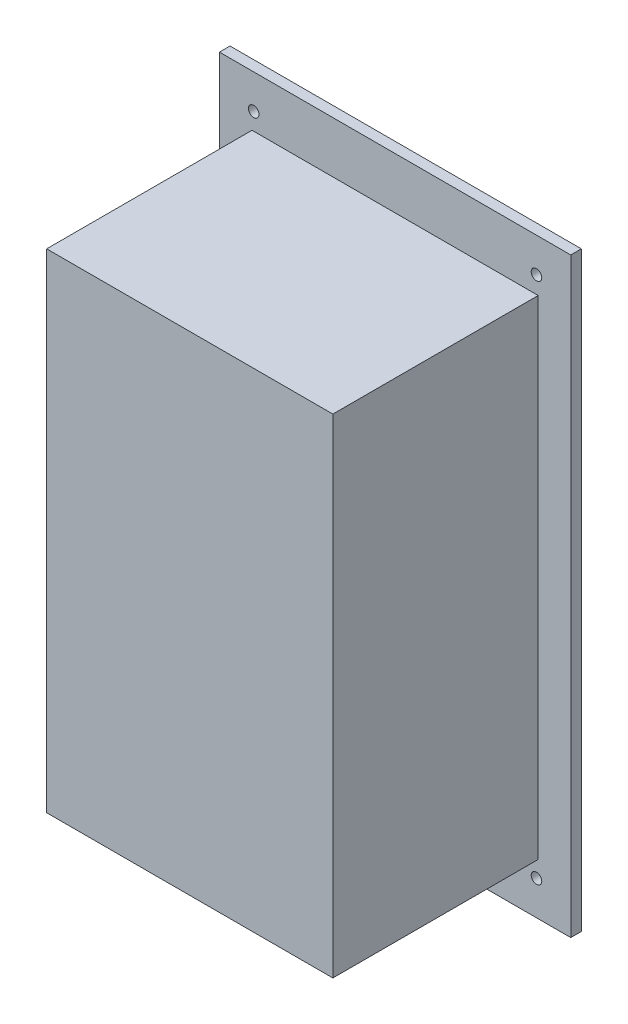
ISO-10303-21;
HEADER;
FILE_DESCRIPTION(('STEP AP214'),'2;1');
FILE_NAME('part.step','',(''),(''),'','','');
FILE_SCHEMA(('AUTOMOTIVE_DESIGN { 1 0 10303 214 1 1 1 1 }'));
ENDSEC;
DATA;
#1=APPLICATION_CONTEXT('core data for automotive mechanical design processes');
#2=APPLICATION_PROTOCOL_DEFINITION('international standard','automotive_design',2000,#1);
#3=PRODUCT_CONTEXT('',#1,'mechanical');
#4=PRODUCT('Part','Part','',(#3));
#5=PRODUCT_RELATED_PRODUCT_CATEGORY('part','',(#4));
#6=PRODUCT_DEFINITION_FORMATION('','',#4);
#7=PRODUCT_DEFINITION_CONTEXT('part definition',#1,'design');
#8=PRODUCT_DEFINITION('design','',#6,#7);
#9=PRODUCT_DEFINITION_SHAPE('','',#8);
#10=(LENGTH_UNIT() NAMED_UNIT(*) SI_UNIT(.MILLI.,.METRE.));
#11=(NAMED_UNIT(*) PLANE_ANGLE_UNIT() SI_UNIT($,.RADIAN.));
#12=(NAMED_UNIT(*) SI_UNIT($,.STERADIAN.) SOLID_ANGLE_UNIT());
#13=UNCERTAINTY_MEASURE_WITH_UNIT(LENGTH_MEASURE(1.E-05),#10,'distance_accuracy_value','');
#14=(GEOMETRIC_REPRESENTATION_CONTEXT(3) GLOBAL_UNCERTAINTY_ASSIGNED_CONTEXT((#13)) GLOBAL_UNIT_ASSIGNED_CONTEXT((#10,
#11,#12)) REPRESENTATION_CONTEXT('',''));
#15=CARTESIAN_POINT('',(0.,0.,0.));
#16=DIRECTION('',(0.,0.,1.));
#17=DIRECTION('',(1.,0.,0.));
#18=AXIS2_PLACEMENT_3D('',#15,#16,#17);
#19=CARTESIAN_POINT('',(-16.7,28.5,25.2));
#20=DIRECTION('',(1.,0.,0.));
#21=DIRECTION('',(0.,0.,-1.));
#22=AXIS2_PLACEMENT_3D('',#19,#20,#21);
#23=PLANE('',#22);
#24=DIRECTION('',(0.,0.,-1.));
#25=VECTOR('',#24,1.);
#26=CARTESIAN_POINT('',(-16.7,28.5,25.2));
#27=LINE('',#26,#25);
#28=CARTESIAN_POINT('',(-16.7,28.5,25.2));
#29=VERTEX_POINT('',#28);
#30=CARTESIAN_POINT('',(-16.7,28.5,1.23456789));
#31=VERTEX_POINT('',#30);
#32=EDGE_CURVE('E143',#29,#31,#27,.T.);
#33=ORIENTED_EDGE('',*,*,#32,.T.);
#34=DIRECTION('',(0.,-1.,0.));
#35=VECTOR('',#34,1.);
#36=CARTESIAN_POINT('',(-16.7,28.5,1.23456789));
#37=LINE('',#36,#35);
#38=CARTESIAN_POINT('',(-16.7,-28.5,1.23456789));
#39=VERTEX_POINT('',#38);
#40=EDGE_CURVE('E49',#31,#39,#37,.T.);
#41=ORIENTED_EDGE('',*,*,#40,.T.);
#42=DIRECTION('',(0.,0.,-1.));
#43=VECTOR('',#42,1.);
#44=CARTESIAN_POINT('',(-16.7,-28.5,25.2));
#45=LINE('',#44,#43);
#46=CARTESIAN_POINT('',(-16.7,-28.5,25.2));
#47=VERTEX_POINT('',#46);
#48=EDGE_CURVE('E41',#47,#39,#45,.T.);
#49=ORIENTED_EDGE('',*,*,#48,.F.);
#50=DIRECTION('',(0.,-1.,0.));
#51=VECTOR('',#50,1.);
#52=CARTESIAN_POINT('',(-16.7,28.5,25.2));
#53=LINE('',#52,#51);
#54=EDGE_CURVE('E136',#29,#47,#53,.T.);
#55=ORIENTED_EDGE('',*,*,#54,.F.);
#56=EDGE_LOOP('',(#33,#41,#49,#55));
#57=FACE_BOUND('',#56,.T.);
#58=ADVANCED_FACE('F33',(#57),#23,.F.);
#59=CARTESIAN_POINT('',(-16.7,-28.5,25.2));
#60=DIRECTION('',(0.,1.,0.));
#61=DIRECTION('',(0.,0.,1.));
#62=AXIS2_PLACEMENT_3D('',#59,#60,#61);
#63=PLANE('',#62);
#64=ORIENTED_EDGE('',*,*,#48,.T.);
#65=DIRECTION('',(1.,0.,0.));
#66=VECTOR('',#65,1.);
#67=CARTESIAN_POINT('',(-16.7,-28.5,1.23456789));
#68=LINE('',#67,#66);
#69=CARTESIAN_POINT('',(16.7,-28.5,1.23456789));
#70=VERTEX_POINT('',#69);
#71=EDGE_CURVE('E127',#39,#70,#68,.T.);
#72=ORIENTED_EDGE('',*,*,#71,.T.);
#73=DIRECTION('',(0.,0.,-1.));
#74=VECTOR('',#73,1.);
#75=CARTESIAN_POINT('',(16.7,-28.5,25.2));
#76=LINE('',#75,#74);
#77=CARTESIAN_POINT('',(16.7,-28.5,25.2));
#78=VERTEX_POINT('',#77);
#79=EDGE_CURVE('E149',#78,#70,#76,.T.);
#80=ORIENTED_EDGE('',*,*,#79,.F.);
#81=DIRECTION('',(1.,0.,0.));
#82=VECTOR('',#81,1.);
#83=CARTESIAN_POINT('',(-16.7,-28.5,25.2));
#84=LINE('',#83,#82);
#85=EDGE_CURVE('E138',#47,#78,#84,.T.);
#86=ORIENTED_EDGE('',*,*,#85,.F.);
#87=EDGE_LOOP('',(#64,#72,#80,#86));
#88=FACE_BOUND('',#87,.T.);
#89=ADVANCED_FACE('F205',(#88),#63,.F.);
#90=CARTESIAN_POINT('',(16.7,28.5,25.2));
#91=DIRECTION('',(-1.,0.,0.));
#92=DIRECTION('',(0.,0.,1.));
#93=AXIS2_PLACEMENT_3D('',#90,#91,#92);
#94=PLANE('',#93);
#95=ORIENTED_EDGE('',*,*,#79,.T.);
#96=DIRECTION('',(0.,1.,0.));
#97=VECTOR('',#96,1.);
#98=CARTESIAN_POINT('',(16.7,28.5,1.23456789));
#99=LINE('',#98,#97);
#100=CARTESIAN_POINT('',(16.7,28.5,1.23456789));
#101=VERTEX_POINT('',#100);
#102=EDGE_CURVE('E124',#70,#101,#99,.T.);
#103=ORIENTED_EDGE('',*,*,#102,.T.);
#104=DIRECTION('',(0.,0.,-1.));
#105=VECTOR('',#104,1.);
#106=CARTESIAN_POINT('',(16.7,28.5,25.2));
#107=LINE('',#106,#105);
#108=CARTESIAN_POINT('',(16.7,28.5,25.2));
#109=VERTEX_POINT('',#108);
#110=EDGE_CURVE('E146',#109,#101,#107,.T.);
#111=ORIENTED_EDGE('',*,*,#110,.F.);
#112=DIRECTION('',(0.,1.,0.));
#113=VECTOR('',#112,1.);
#114=CARTESIAN_POINT('',(16.7,28.5,25.2));
#115=LINE('',#114,#113);
#116=EDGE_CURVE('E140',#78,#109,#115,.T.);
#117=ORIENTED_EDGE('',*,*,#116,.F.);
#118=EDGE_LOOP('',(#95,#103,#111,#117));
#119=FACE_BOUND('',#118,.T.);
#120=ADVANCED_FACE('F210',(#119),#94,.F.);
#121=CARTESIAN_POINT('',(-16.7,28.5,25.2));
#122=DIRECTION('',(0.,-1.,0.));
#123=DIRECTION('',(0.,0.,-1.));
#124=AXIS2_PLACEMENT_3D('',#121,#122,#123);
#125=PLANE('',#124);
#126=ORIENTED_EDGE('',*,*,#110,.T.);
#127=DIRECTION('',(-1.,0.,0.));
#128=VECTOR('',#127,1.);
#129=CARTESIAN_POINT('',(-16.7,28.5,1.23456789));
#130=LINE('',#129,#128);
#131=EDGE_CURVE('E11',#101,#31,#130,.T.);
#132=ORIENTED_EDGE('',*,*,#131,.T.);
#133=ORIENTED_EDGE('',*,*,#32,.F.);
#134=DIRECTION('',(-1.,0.,0.));
#135=VECTOR('',#134,1.);
#136=CARTESIAN_POINT('',(-16.7,28.5,25.2));
#137=LINE('',#136,#135);
#138=EDGE_CURVE('E56',#109,#29,#137,.T.);
#139=ORIENTED_EDGE('',*,*,#138,.F.);
#140=EDGE_LOOP('',(#126,#132,#133,#139));
#141=FACE_BOUND('',#140,.T.);
#142=ADVANCED_FACE('F215',(#141),#125,.F.);
#143=CARTESIAN_POINT('',(0.,0.,25.2));
#144=DIRECTION('',(0.,0.,1.));
#145=DIRECTION('',(1.,0.,0.));
#146=AXIS2_PLACEMENT_3D('',#143,#144,#145);
#147=PLANE('',#146);
#148=ORIENTED_EDGE('',*,*,#54,.T.);
#149=ORIENTED_EDGE('',*,*,#85,.T.);
#150=ORIENTED_EDGE('',*,*,#116,.T.);
#151=ORIENTED_EDGE('',*,*,#138,.T.);
#152=EDGE_LOOP('',(#148,#149,#150,#151));
#153=FACE_BOUND('',#152,.T.);
#154=ADVANCED_FACE('F220',(#153),#147,.T.);
#155=CARTESIAN_POINT('',(0.,0.,1.23456789));
#156=DIRECTION('',(0.,0.,1.));
#157=DIRECTION('',(1.,0.,0.));
#158=AXIS2_PLACEMENT_3D('',#155,#156,#157);
#159=PLANE('',#158);
#160=CARTESIAN_POINT('',(16.5,30.5,1.23456789));
#161=DIRECTION('',(0.,0.,1.));
#162=DIRECTION('',(1.,0.,0.));
#163=AXIS2_PLACEMENT_3D('',#160,#161,#162);
#164=CIRCLE('',#163,0.617283944999998);
#165=CARTESIAN_POINT('',(17.117283945,30.5,1.23456789));
#166=VERTEX_POINT('',#165);
#167=EDGE_CURVE('E174',#166,#166,#164,.T.);
#168=ORIENTED_EDGE('',*,*,#167,.F.);
#169=EDGE_LOOP('',(#168));
#170=FACE_BOUND('',#169,.T.);
#171=CARTESIAN_POINT('',(-16.5,-30.5,1.23456789));
#172=DIRECTION('',(0.,0.,1.));
#173=DIRECTION('',(1.,0.,0.));
#174=AXIS2_PLACEMENT_3D('',#171,#172,#173);
#175=CIRCLE('',#174,0.617283944999998);
#176=CARTESIAN_POINT('',(-15.882716055,-30.5,1.23456789));
#177=VERTEX_POINT('',#176);
#178=EDGE_CURVE('E163',#177,#177,#175,.T.);
#179=ORIENTED_EDGE('',*,*,#178,.F.);
#180=EDGE_LOOP('',(#179));
#181=FACE_BOUND('',#180,.T.);
#182=CARTESIAN_POINT('',(-16.5,30.5,1.23456789));
#183=DIRECTION('',(0.,0.,1.));
#184=DIRECTION('',(1.,0.,0.));
#185=AXIS2_PLACEMENT_3D('',#182,#183,#184);
#186=CIRCLE('',#185,0.617283944999998);
#187=CARTESIAN_POINT('',(-15.882716055,30.5,1.23456789));
#188=VERTEX_POINT('',#187);
#189=EDGE_CURVE('E160',#188,#188,#186,.T.);
#190=ORIENTED_EDGE('',*,*,#189,.F.);
#191=EDGE_LOOP('',(#190));
#192=FACE_BOUND('',#191,.T.);
#193=CARTESIAN_POINT('',(16.5,-30.5,1.23456789));
#194=DIRECTION('',(0.,0.,1.));
#195=DIRECTION('',(1.,0.,0.));
#196=AXIS2_PLACEMENT_3D('',#193,#194,#195);
#197=CIRCLE('',#196,0.617283944999998);
#198=CARTESIAN_POINT('',(17.117283945,-30.5,1.23456789));
#199=VERTEX_POINT('',#198);
#200=EDGE_CURVE('E157',#199,#199,#197,.T.);
#201=ORIENTED_EDGE('',*,*,#200,.F.);
#202=EDGE_LOOP('',(#201));
#203=FACE_BOUND('',#202,.T.);
#204=DIRECTION('',(0.,-1.,0.));
#205=VECTOR('',#204,1.);
#206=CARTESIAN_POINT('',(-20.5,34.5,1.23456789));
#207=LINE('',#206,#205);
#208=CARTESIAN_POINT('',(-20.5,34.5,1.23456789));
#209=VERTEX_POINT('',#208);
#210=CARTESIAN_POINT('',(-20.5,-34.5,1.23456789));
#211=VERTEX_POINT('',#210);
#212=EDGE_CURVE('E110',#209,#211,#207,.T.);
#213=ORIENTED_EDGE('',*,*,#212,.T.);
#214=DIRECTION('',(1.,0.,0.));
#215=VECTOR('',#214,1.);
#216=CARTESIAN_POINT('',(-20.5,-34.5,1.23456789));
#217=LINE('',#216,#215);
#218=CARTESIAN_POINT('',(20.5,-34.5,1.23456789));
#219=VERTEX_POINT('',#218);
#220=EDGE_CURVE('E99',#211,#219,#217,.T.);
#221=ORIENTED_EDGE('',*,*,#220,.T.);
#222=DIRECTION('',(0.,1.,0.));
#223=VECTOR('',#222,1.);
#224=CARTESIAN_POINT('',(20.5,34.5,1.23456789));
#225=LINE('',#224,#223);
#226=CARTESIAN_POINT('',(20.5,34.5,1.23456789));
#227=VERTEX_POINT('',#226);
#228=EDGE_CURVE('E109',#219,#227,#225,.T.);
#229=ORIENTED_EDGE('',*,*,#228,.T.);
#230=DIRECTION('',(-1.,0.,0.));
#231=VECTOR('',#230,1.);
#232=CARTESIAN_POINT('',(-20.5,34.5,1.23456789));
#233=LINE('',#232,#231);
#234=EDGE_CURVE('E115',#227,#209,#233,.T.);
#235=ORIENTED_EDGE('',*,*,#234,.T.);
#236=EDGE_LOOP('',(#213,#221,#229,#235));
#237=FACE_BOUND('',#236,.T.);
#238=ORIENTED_EDGE('',*,*,#40,.F.);
#239=ORIENTED_EDGE('',*,*,#131,.F.);
#240=ORIENTED_EDGE('',*,*,#102,.F.);
#241=ORIENTED_EDGE('',*,*,#71,.F.);
#242=EDGE_LOOP('',(#238,#239,#240,#241));
#243=FACE_BOUND('',#242,.T.);
#244=ADVANCED_FACE('F113',(#170,#181,#192,#203,#237,#243),#159,.T.);
#245=CARTESIAN_POINT('',(-20.5,34.5,1.23456789));
#246=DIRECTION('',(1.,0.,0.));
#247=DIRECTION('',(0.,0.,-1.));
#248=AXIS2_PLACEMENT_3D('',#245,#246,#247);
#249=PLANE('',#248);
#250=DIRECTION('',(0.,-1.,0.));
#251=VECTOR('',#250,1.);
#252=CARTESIAN_POINT('',(-20.5,34.5,0.));
#253=LINE('',#252,#251);
#254=CARTESIAN_POINT('',(-20.5,34.5,0.));
#255=VERTEX_POINT('',#254);
#256=CARTESIAN_POINT('',(-20.5,-34.5,0.));
#257=VERTEX_POINT('',#256);
#258=EDGE_CURVE('E123',#255,#257,#253,.T.);
#259=ORIENTED_EDGE('',*,*,#258,.T.);
#260=DIRECTION('',(0.,0.,-1.));
#261=VECTOR('',#260,1.);
#262=CARTESIAN_POINT('',(-20.5,-34.5,1.23456789));
#263=LINE('',#262,#261);
#264=EDGE_CURVE('E103',#211,#257,#263,.T.);
#265=ORIENTED_EDGE('',*,*,#264,.F.);
#266=ORIENTED_EDGE('',*,*,#212,.F.);
#267=DIRECTION('',(0.,0.,-1.));
#268=VECTOR('',#267,1.);
#269=CARTESIAN_POINT('',(-20.5,34.5,1.23456789));
#270=LINE('',#269,#268);
#271=EDGE_CURVE('E179',#209,#255,#270,.T.);
#272=ORIENTED_EDGE('',*,*,#271,.T.);
#273=EDGE_LOOP('',(#259,#265,#266,#272));
#274=FACE_BOUND('',#273,.T.);
#275=ADVANCED_FACE('F121',(#274),#249,.F.);
#276=CARTESIAN_POINT('',(-20.5,-34.5,1.23456789));
#277=DIRECTION('',(0.,1.,0.));
#278=DIRECTION('',(0.,0.,1.));
#279=AXIS2_PLACEMENT_3D('',#276,#277,#278);
#280=PLANE('',#279);
#281=DIRECTION('',(1.,0.,0.));
#282=VECTOR('',#281,1.);
#283=CARTESIAN_POINT('',(-20.5,-34.5,0.));
#284=LINE('',#283,#282);
#285=CARTESIAN_POINT('',(20.5,-34.5,0.));
#286=VERTEX_POINT('',#285);
#287=EDGE_CURVE('E181',#257,#286,#284,.T.);
#288=ORIENTED_EDGE('',*,*,#287,.T.);
#289=DIRECTION('',(0.,0.,-1.));
#290=VECTOR('',#289,1.);
#291=CARTESIAN_POINT('',(20.5,-34.5,1.23456789));
#292=LINE('',#291,#290);
#293=EDGE_CURVE('E106',#219,#286,#292,.T.);
#294=ORIENTED_EDGE('',*,*,#293,.F.);
#295=ORIENTED_EDGE('',*,*,#220,.F.);
#296=ORIENTED_EDGE('',*,*,#264,.T.);
#297=EDGE_LOOP('',(#288,#294,#295,#296));
#298=FACE_BOUND('',#297,.T.);
#299=ADVANCED_FACE('F101',(#298),#280,.F.);
#300=CARTESIAN_POINT('',(20.5,34.5,1.23456789));
#301=DIRECTION('',(-1.,0.,0.));
#302=DIRECTION('',(0.,0.,1.));
#303=AXIS2_PLACEMENT_3D('',#300,#301,#302);
#304=PLANE('',#303);
#305=DIRECTION('',(0.,1.,0.));
#306=VECTOR('',#305,1.);
#307=CARTESIAN_POINT('',(20.5,34.5,0.));
#308=LINE('',#307,#306);
#309=CARTESIAN_POINT('',(20.5,34.5,0.));
#310=VERTEX_POINT('',#309);
#311=EDGE_CURVE('E183',#286,#310,#308,.T.);
#312=ORIENTED_EDGE('',*,*,#311,.T.);
#313=DIRECTION('',(0.,0.,-1.));
#314=VECTOR('',#313,1.);
#315=CARTESIAN_POINT('',(20.5,34.5,1.23456789));
#316=LINE('',#315,#314);
#317=EDGE_CURVE('E129',#227,#310,#316,.T.);
#318=ORIENTED_EDGE('',*,*,#317,.F.);
#319=ORIENTED_EDGE('',*,*,#228,.F.);
#320=ORIENTED_EDGE('',*,*,#293,.T.);
#321=EDGE_LOOP('',(#312,#318,#319,#320));
#322=FACE_BOUND('',#321,.T.);
#323=ADVANCED_FACE('F195',(#322),#304,.F.);
#324=CARTESIAN_POINT('',(-20.5,34.5,1.23456789));
#325=DIRECTION('',(0.,-1.,0.));
#326=DIRECTION('',(0.,0.,-1.));
#327=AXIS2_PLACEMENT_3D('',#324,#325,#326);
#328=PLANE('',#327);
#329=DIRECTION('',(-1.,0.,0.));
#330=VECTOR('',#329,1.);
#331=CARTESIAN_POINT('',(-20.5,34.5,0.));
#332=LINE('',#331,#330);
#333=EDGE_CURVE('E119',#310,#255,#332,.T.);
#334=ORIENTED_EDGE('',*,*,#333,.T.);
#335=ORIENTED_EDGE('',*,*,#271,.F.);
#336=ORIENTED_EDGE('',*,*,#234,.F.);
#337=ORIENTED_EDGE('',*,*,#317,.T.);
#338=EDGE_LOOP('',(#334,#335,#336,#337));
#339=FACE_BOUND('',#338,.T.);
#340=ADVANCED_FACE('F190',(#339),#328,.F.);
#341=CARTESIAN_POINT('',(0.,0.,0.));
#342=DIRECTION('',(0.,0.,1.));
#343=DIRECTION('',(1.,0.,0.));
#344=AXIS2_PLACEMENT_3D('',#341,#342,#343);
#345=PLANE('',#344);
#346=CARTESIAN_POINT('',(16.5,30.5,0.));
#347=DIRECTION('',(0.,0.,1.));
#348=DIRECTION('',(1.,0.,0.));
#349=AXIS2_PLACEMENT_3D('',#346,#347,#348);
#350=CIRCLE('',#349,0.617283944999998);
#351=CARTESIAN_POINT('',(17.117283945,30.5,0.));
#352=VERTEX_POINT('',#351);
#353=EDGE_CURVE('E36',#352,#352,#350,.T.);
#354=ORIENTED_EDGE('',*,*,#353,.T.);
#355=EDGE_LOOP('',(#354));
#356=FACE_BOUND('',#355,.T.);
#357=CARTESIAN_POINT('',(-16.5,-30.5,0.));
#358=DIRECTION('',(0.,0.,1.));
#359=DIRECTION('',(1.,0.,0.));
#360=AXIS2_PLACEMENT_3D('',#357,#358,#359);
#361=CIRCLE('',#360,0.617283944999998);
#362=CARTESIAN_POINT('',(-15.882716055,-30.5,0.));
#363=VERTEX_POINT('',#362);
#364=EDGE_CURVE('E161',#363,#363,#361,.T.);
#365=ORIENTED_EDGE('',*,*,#364,.T.);
#366=EDGE_LOOP('',(#365));
#367=FACE_BOUND('',#366,.T.);
#368=CARTESIAN_POINT('',(-16.5,30.5,0.));
#369=DIRECTION('',(0.,0.,1.));
#370=DIRECTION('',(1.,0.,0.));
#371=AXIS2_PLACEMENT_3D('',#368,#369,#370);
#372=CIRCLE('',#371,0.617283944999998);
#373=CARTESIAN_POINT('',(-15.882716055,30.5,0.));
#374=VERTEX_POINT('',#373);
#375=EDGE_CURVE('E158',#374,#374,#372,.T.);
#376=ORIENTED_EDGE('',*,*,#375,.T.);
#377=EDGE_LOOP('',(#376));
#378=FACE_BOUND('',#377,.T.);
#379=CARTESIAN_POINT('',(16.5,-30.5,0.));
#380=DIRECTION('',(0.,0.,1.));
#381=DIRECTION('',(1.,0.,0.));
#382=AXIS2_PLACEMENT_3D('',#379,#380,#381);
#383=CIRCLE('',#382,0.617283944999998);
#384=CARTESIAN_POINT('',(17.117283945,-30.5,0.));
#385=VERTEX_POINT('',#384);
#386=EDGE_CURVE('E154',#385,#385,#383,.T.);
#387=ORIENTED_EDGE('',*,*,#386,.T.);
#388=EDGE_LOOP('',(#387));
#389=FACE_BOUND('',#388,.T.);
#390=ORIENTED_EDGE('',*,*,#258,.F.);
#391=ORIENTED_EDGE('',*,*,#333,.F.);
#392=ORIENTED_EDGE('',*,*,#311,.F.);
#393=ORIENTED_EDGE('',*,*,#287,.F.);
#394=EDGE_LOOP('',(#390,#391,#392,#393));
#395=FACE_BOUND('',#394,.T.);
#396=ADVANCED_FACE('F194',(#356,#367,#378,#389,#395),#345,.F.);
#397=CARTESIAN_POINT('',(16.5,-30.5,-1.2E-05));
#398=DIRECTION('',(0.,0.,1.));
#399=DIRECTION('',(1.,0.,0.));
#400=AXIS2_PLACEMENT_3D('',#397,#398,#399);
#401=CYLINDRICAL_SURFACE('',#400,0.617283944999998);
#402=ORIENTED_EDGE('',*,*,#200,.T.);
#403=EDGE_LOOP('',(#402));
#404=FACE_BOUND('',#403,.T.);
#405=ORIENTED_EDGE('',*,*,#386,.F.);
#406=EDGE_LOOP('',(#405));
#407=FACE_BOUND('',#406,.T.);
#408=ADVANCED_FACE('F233',(#404,#407),#401,.F.);
#409=CARTESIAN_POINT('',(-16.5,30.5,-1.2E-05));
#410=DIRECTION('',(0.,0.,1.));
#411=DIRECTION('',(1.,0.,0.));
#412=AXIS2_PLACEMENT_3D('',#409,#410,#411);
#413=CYLINDRICAL_SURFACE('',#412,0.617283944999998);
#414=ORIENTED_EDGE('',*,*,#189,.T.);
#415=EDGE_LOOP('',(#414));
#416=FACE_BOUND('',#415,.T.);
#417=ORIENTED_EDGE('',*,*,#375,.F.);
#418=EDGE_LOOP('',(#417));
#419=FACE_BOUND('',#418,.T.);
#420=ADVANCED_FACE('F291',(#416,#419),#413,.F.);
#421=CARTESIAN_POINT('',(-16.5,-30.5,-1.2E-05));
#422=DIRECTION('',(0.,0.,1.));
#423=DIRECTION('',(1.,0.,0.));
#424=AXIS2_PLACEMENT_3D('',#421,#422,#423);
#425=CYLINDRICAL_SURFACE('',#424,0.617283944999998);
#426=ORIENTED_EDGE('',*,*,#178,.T.);
#427=EDGE_LOOP('',(#426));
#428=FACE_BOUND('',#427,.T.);
#429=ORIENTED_EDGE('',*,*,#364,.F.);
#430=EDGE_LOOP('',(#429));
#431=FACE_BOUND('',#430,.T.);
#432=ADVANCED_FACE('F301',(#428,#431),#425,.F.);
#433=CARTESIAN_POINT('',(16.5,30.5,-1.2E-05));
#434=DIRECTION('',(0.,0.,1.));
#435=DIRECTION('',(1.,0.,0.));
#436=AXIS2_PLACEMENT_3D('',#433,#434,#435);
#437=CYLINDRICAL_SURFACE('',#436,0.617283944999998);
#438=ORIENTED_EDGE('',*,*,#167,.T.);
#439=EDGE_LOOP('',(#438));
#440=FACE_BOUND('',#439,.T.);
#441=ORIENTED_EDGE('',*,*,#353,.F.);
#442=EDGE_LOOP('',(#441));
#443=FACE_BOUND('',#442,.T.);
#444=ADVANCED_FACE('F310',(#440,#443),#437,.F.);
#445=CLOSED_SHELL('',(#58,#89,#120,#142,#154,#244,#275,#299,#323,#340,#396,#408,#420,#432,#444));
#446=MANIFOLD_SOLID_BREP('B2',#445);
#447=ADVANCED_BREP_SHAPE_REPRESENTATION('',(#18,#446),#14);
#448=SHAPE_DEFINITION_REPRESENTATION(#9,#447);
ENDSEC;
END-ISO-10303-21;
